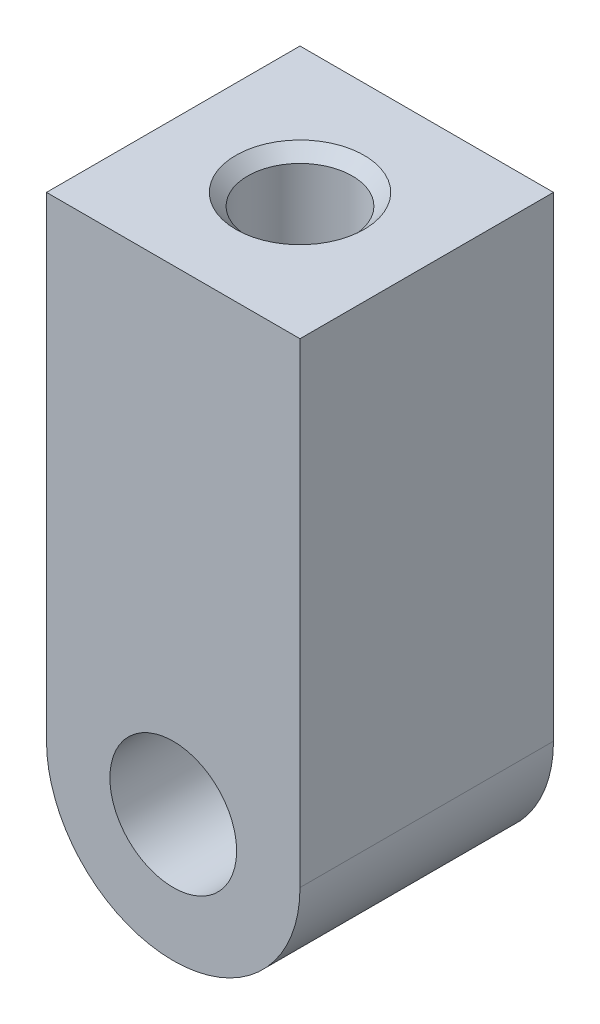
ISO-10303-21;
HEADER;
FILE_DESCRIPTION(('STEP AP214'),'2;1');
FILE_NAME('part.step','',(''),(''),'','','');
FILE_SCHEMA(('AUTOMOTIVE_DESIGN { 1 0 10303 214 1 1 1 1 }'));
ENDSEC;
DATA;
#1=APPLICATION_CONTEXT('core data for automotive mechanical design processes');
#2=APPLICATION_PROTOCOL_DEFINITION('international standard','automotive_design',2000,#1);
#3=PRODUCT_CONTEXT('',#1,'mechanical');
#4=PRODUCT('Part','Part','',(#3));
#5=PRODUCT_RELATED_PRODUCT_CATEGORY('part','',(#4));
#6=PRODUCT_DEFINITION_FORMATION('','',#4);
#7=PRODUCT_DEFINITION_CONTEXT('part definition',#1,'design');
#8=PRODUCT_DEFINITION('design','',#6,#7);
#9=PRODUCT_DEFINITION_SHAPE('','',#8);
#10=(LENGTH_UNIT() NAMED_UNIT(*) SI_UNIT(.MILLI.,.METRE.));
#11=(NAMED_UNIT(*) PLANE_ANGLE_UNIT() SI_UNIT($,.RADIAN.));
#12=(NAMED_UNIT(*) SI_UNIT($,.STERADIAN.) SOLID_ANGLE_UNIT());
#13=UNCERTAINTY_MEASURE_WITH_UNIT(LENGTH_MEASURE(1.E-05),#10,'distance_accuracy_value','');
#14=(GEOMETRIC_REPRESENTATION_CONTEXT(3) GLOBAL_UNCERTAINTY_ASSIGNED_CONTEXT((#13)) GLOBAL_UNIT_ASSIGNED_CONTEXT((#10,
#11,#12)) REPRESENTATION_CONTEXT('',''));
#15=CARTESIAN_POINT('',(0.,0.,0.));
#16=DIRECTION('',(0.,0.,1.));
#17=DIRECTION('',(1.,0.,0.));
#18=AXIS2_PLACEMENT_3D('',#15,#16,#17);
#19=CARTESIAN_POINT('',(0.,0.,8.));
#20=DIRECTION('',(0.,0.,1.));
#21=DIRECTION('',(1.,0.,0.));
#22=AXIS2_PLACEMENT_3D('',#19,#20,#21);
#23=PLANE('',#22);
#24=CARTESIAN_POINT('',(0.,0.,8.));
#25=DIRECTION('',(0.,0.,1.));
#26=DIRECTION('',(1.,0.,0.));
#27=AXIS2_PLACEMENT_3D('',#24,#25,#26);
#28=CIRCLE('',#27,4.);
#29=CARTESIAN_POINT('',(-4.,0.,8.));
#30=VERTEX_POINT('',#29);
#31=CARTESIAN_POINT('',(4.,0.,8.));
#32=VERTEX_POINT('',#31);
#33=EDGE_CURVE('E91',#30,#32,#28,.T.);
#34=ORIENTED_EDGE('',*,*,#33,.T.);
#35=DIRECTION('',(0.,1.,0.));
#36=VECTOR('',#35,1.);
#37=CARTESIAN_POINT('',(4.,0.,8.));
#38=LINE('',#37,#36);
#39=CARTESIAN_POINT('',(4.,15.,8.));
#40=VERTEX_POINT('',#39);
#41=EDGE_CURVE('E86',#32,#40,#38,.T.);
#42=ORIENTED_EDGE('',*,*,#41,.T.);
#43=DIRECTION('',(-1.,0.,0.));
#44=VECTOR('',#43,1.);
#45=CARTESIAN_POINT('',(4.,15.,8.));
#46=LINE('',#45,#44);
#47=CARTESIAN_POINT('',(-4.,15.,8.));
#48=VERTEX_POINT('',#47);
#49=EDGE_CURVE('E89',#40,#48,#46,.T.);
#50=ORIENTED_EDGE('',*,*,#49,.T.);
#51=DIRECTION('',(0.,-1.,0.));
#52=VECTOR('',#51,1.);
#53=CARTESIAN_POINT('',(-4.,15.,8.));
#54=LINE('',#53,#52);
#55=EDGE_CURVE('E56',#48,#30,#54,.T.);
#56=ORIENTED_EDGE('',*,*,#55,.T.);
#57=EDGE_LOOP('',(#34,#42,#50,#56));
#58=FACE_BOUND('',#57,.T.);
#59=CARTESIAN_POINT('',(0.,0.,8.));
#60=DIRECTION('',(0.,0.,1.));
#61=DIRECTION('',(1.,0.,0.));
#62=AXIS2_PLACEMENT_3D('',#59,#60,#61);
#63=CIRCLE('',#62,2.);
#64=CARTESIAN_POINT('',(2.,0.,8.));
#65=VERTEX_POINT('',#64);
#66=EDGE_CURVE('E106',#65,#65,#63,.T.);
#67=ORIENTED_EDGE('',*,*,#66,.F.);
#68=EDGE_LOOP('',(#67));
#69=FACE_BOUND('',#68,.T.);
#70=ADVANCED_FACE('F39',(#58,#69),#23,.T.);
#71=CARTESIAN_POINT('',(0.,0.,0.));
#72=DIRECTION('',(0.,0.,1.));
#73=DIRECTION('',(1.,0.,0.));
#74=AXIS2_PLACEMENT_3D('',#71,#72,#73);
#75=PLANE('',#74);
#76=CARTESIAN_POINT('',(0.,0.,0.));
#77=DIRECTION('',(0.,0.,1.));
#78=DIRECTION('',(1.,0.,0.));
#79=AXIS2_PLACEMENT_3D('',#76,#77,#78);
#80=CIRCLE('',#79,4.);
#81=CARTESIAN_POINT('',(-4.,0.,0.));
#82=VERTEX_POINT('',#81);
#83=CARTESIAN_POINT('',(4.,0.,0.));
#84=VERTEX_POINT('',#83);
#85=EDGE_CURVE('E103',#82,#84,#80,.T.);
#86=ORIENTED_EDGE('',*,*,#85,.F.);
#87=DIRECTION('',(0.,-1.,0.));
#88=VECTOR('',#87,1.);
#89=CARTESIAN_POINT('',(-4.,15.,0.));
#90=LINE('',#89,#88);
#91=CARTESIAN_POINT('',(-4.,15.,0.));
#92=VERTEX_POINT('',#91);
#93=EDGE_CURVE('E79',#92,#82,#90,.T.);
#94=ORIENTED_EDGE('',*,*,#93,.F.);
#95=DIRECTION('',(-1.,0.,0.));
#96=VECTOR('',#95,1.);
#97=CARTESIAN_POINT('',(4.,15.,0.));
#98=LINE('',#97,#96);
#99=CARTESIAN_POINT('',(4.,15.,0.));
#100=VERTEX_POINT('',#99);
#101=EDGE_CURVE('E73',#100,#92,#98,.T.);
#102=ORIENTED_EDGE('',*,*,#101,.F.);
#103=DIRECTION('',(0.,1.,0.));
#104=VECTOR('',#103,1.);
#105=CARTESIAN_POINT('',(4.,0.,0.));
#106=LINE('',#105,#104);
#107=EDGE_CURVE('E95',#84,#100,#106,.T.);
#108=ORIENTED_EDGE('',*,*,#107,.F.);
#109=EDGE_LOOP('',(#86,#94,#102,#108));
#110=FACE_BOUND('',#109,.T.);
#111=CARTESIAN_POINT('',(0.,0.,0.));
#112=DIRECTION('',(0.,0.,1.));
#113=DIRECTION('',(1.,0.,0.));
#114=AXIS2_PLACEMENT_3D('',#111,#112,#113);
#115=CIRCLE('',#114,2.);
#116=CARTESIAN_POINT('',(2.,0.,0.));
#117=VERTEX_POINT('',#116);
#118=EDGE_CURVE('E118',#117,#117,#115,.T.);
#119=ORIENTED_EDGE('',*,*,#118,.T.);
#120=EDGE_LOOP('',(#119));
#121=FACE_BOUND('',#120,.T.);
#122=ADVANCED_FACE('F114',(#110,#121),#75,.F.);
#123=CARTESIAN_POINT('',(0.,0.,8.));
#124=DIRECTION('',(0.,0.,-1.));
#125=DIRECTION('',(-1.,0.,0.));
#126=AXIS2_PLACEMENT_3D('',#123,#124,#125);
#127=CYLINDRICAL_SURFACE('',#126,4.);
#128=ORIENTED_EDGE('',*,*,#85,.T.);
#129=DIRECTION('',(0.,0.,-1.));
#130=VECTOR('',#129,1.);
#131=CARTESIAN_POINT('',(4.,0.,8.));
#132=LINE('',#131,#130);
#133=EDGE_CURVE('E11',#32,#84,#132,.T.);
#134=ORIENTED_EDGE('',*,*,#133,.F.);
#135=ORIENTED_EDGE('',*,*,#33,.F.);
#136=DIRECTION('',(0.,0.,-1.));
#137=VECTOR('',#136,1.);
#138=CARTESIAN_POINT('',(-4.,0.,8.));
#139=LINE('',#138,#137);
#140=EDGE_CURVE('E99',#30,#82,#139,.T.);
#141=ORIENTED_EDGE('',*,*,#140,.T.);
#142=EDGE_LOOP('',(#128,#134,#135,#141));
#143=FACE_BOUND('',#142,.T.);
#144=ADVANCED_FACE('F41',(#143),#127,.T.);
#145=CARTESIAN_POINT('',(4.,0.,8.));
#146=DIRECTION('',(-1.,0.,0.));
#147=DIRECTION('',(0.,-1.,0.));
#148=AXIS2_PLACEMENT_3D('',#145,#146,#147);
#149=PLANE('',#148);
#150=ORIENTED_EDGE('',*,*,#107,.T.);
#151=DIRECTION('',(0.,0.,-1.));
#152=VECTOR('',#151,1.);
#153=CARTESIAN_POINT('',(4.,15.,8.));
#154=LINE('',#153,#152);
#155=EDGE_CURVE('E48',#40,#100,#154,.T.);
#156=ORIENTED_EDGE('',*,*,#155,.F.);
#157=ORIENTED_EDGE('',*,*,#41,.F.);
#158=ORIENTED_EDGE('',*,*,#133,.T.);
#159=EDGE_LOOP('',(#150,#156,#157,#158));
#160=FACE_BOUND('',#159,.T.);
#161=ADVANCED_FACE('F94',(#160),#149,.F.);
#162=CARTESIAN_POINT('',(4.,15.,8.));
#163=DIRECTION('',(0.,-1.,0.));
#164=DIRECTION('',(1.,0.,0.));
#165=AXIS2_PLACEMENT_3D('',#162,#163,#164);
#166=PLANE('',#165);
#167=CARTESIAN_POINT('',(0.,15.,4.));
#168=DIRECTION('',(0.,1.,0.));
#169=DIRECTION('',(0.,0.,1.));
#170=AXIS2_PLACEMENT_3D('',#167,#168,#169);
#171=CIRCLE('',#170,2.025);
#172=CARTESIAN_POINT('',(0.,15.,6.025));
#173=VERTEX_POINT('',#172);
#174=EDGE_CURVE('E231',#173,#173,#171,.T.);
#175=ORIENTED_EDGE('',*,*,#174,.F.);
#176=EDGE_LOOP('',(#175));
#177=FACE_BOUND('',#176,.T.);
#178=ORIENTED_EDGE('',*,*,#101,.T.);
#179=DIRECTION('',(0.,0.,-1.));
#180=VECTOR('',#179,1.);
#181=CARTESIAN_POINT('',(-4.,15.,8.));
#182=LINE('',#181,#180);
#183=EDGE_CURVE('E96',#48,#92,#182,.T.);
#184=ORIENTED_EDGE('',*,*,#183,.F.);
#185=ORIENTED_EDGE('',*,*,#49,.F.);
#186=ORIENTED_EDGE('',*,*,#155,.T.);
#187=EDGE_LOOP('',(#178,#184,#185,#186));
#188=FACE_BOUND('',#187,.T.);
#189=ADVANCED_FACE('F97',(#177,#188),#166,.F.);
#190=CARTESIAN_POINT('',(-4.,15.,8.));
#191=DIRECTION('',(1.,0.,0.));
#192=DIRECTION('',(0.,1.,0.));
#193=AXIS2_PLACEMENT_3D('',#190,#191,#192);
#194=PLANE('',#193);
#195=ORIENTED_EDGE('',*,*,#93,.T.);
#196=ORIENTED_EDGE('',*,*,#140,.F.);
#197=ORIENTED_EDGE('',*,*,#55,.F.);
#198=ORIENTED_EDGE('',*,*,#183,.T.);
#199=EDGE_LOOP('',(#195,#196,#197,#198));
#200=FACE_BOUND('',#199,.T.);
#201=ADVANCED_FACE('F111',(#200),#194,.F.);
#202=CARTESIAN_POINT('',(0.,0.,8.));
#203=DIRECTION('',(0.,0.,-1.));
#204=DIRECTION('',(-1.,0.,0.));
#205=AXIS2_PLACEMENT_3D('',#202,#203,#204);
#206=CYLINDRICAL_SURFACE('',#205,2.);
#207=CARTESIAN_POINT('',(0.,2.,5.65));
#208=CARTESIAN_POINT('',(-0.0785582667604114,1.99999366658903,5.64999350864754));
#209=CARTESIAN_POINT('',(-0.157187203120869,1.99532684549041,5.64434512093698));
#210=CARTESIAN_POINT('',(-0.311864639119565,1.97707676446012,5.62215000896264));
#211=CARTESIAN_POINT('',(-0.387909229411207,1.96348057790889,5.60558748470299));
#212=CARTESIAN_POINT('',(-0.534791047337124,1.92864279933125,5.56279134157272));
#213=CARTESIAN_POINT('',(-0.605657458967865,1.90744880464853,5.53661790708388));
#214=CARTESIAN_POINT('',(-0.741387966566496,1.85891132508154,5.47593393904634));
#215=CARTESIAN_POINT('',(-0.806250869204592,1.83156662129763,5.44142175288806));
#216=CARTESIAN_POINT('',(-0.951700806708838,1.76151205715045,5.35147931277491));
#217=CARTESIAN_POINT('',(-1.02945448662967,1.71682701371144,5.29300268475238));
#218=CARTESIAN_POINT('',(-1.172252458918,1.62270689094313,5.16514433141969));
#219=CARTESIAN_POINT('',(-1.23725977062541,1.57325859344596,5.09573189920763));
#220=CARTESIAN_POINT('',(-1.3554292865677,1.47271642854877,4.94582794490879));
#221=CARTESIAN_POINT('',(-1.40835986186317,1.42160893874489,4.86516109270983));
#222=CARTESIAN_POINT('',(-1.4772320555906,1.3486716085019,4.73663576212628));
#223=CARTESIAN_POINT('',(-1.49842304085224,1.3249968757223,4.69257719190757));
#224=CARTESIAN_POINT('',(-1.53713061973868,1.27988584459917,4.60180064065173));
#225=CARTESIAN_POINT('',(-1.55465036884759,1.25844763195792,4.5550849877));
#226=CARTESIAN_POINT('',(-1.5873810081882,1.21696065736944,4.45371028176249));
#227=CARTESIAN_POINT('',(-1.60214217801139,1.19730807425635,4.39873684547993));
#228=CARTESIAN_POINT('',(-1.62608774735319,1.16458343953829,4.28575684255247));
#229=CARTESIAN_POINT('',(-1.63528596332251,1.15149509856243,4.2277581823516));
#230=CARTESIAN_POINT('',(-1.64748010660325,1.13399110780644,4.10906084287105));
#231=CARTESIAN_POINT('',(-1.65040522091686,1.12967450475142,4.04833915647673));
#232=CARTESIAN_POINT('',(-1.64950300780659,1.13099037118302,3.92705019651996));
#233=CARTESIAN_POINT('',(-1.64567372646979,1.13662571957271,3.86648297271646));
#234=CARTESIAN_POINT('',(-1.63095758572914,1.15764682115701,3.74143465931325));
#235=CARTESIAN_POINT('',(-1.6193750060645,1.17398997972638,3.67720600800186));
#236=CARTESIAN_POINT('',(-1.5895119825712,1.21411476501242,3.55270021447618));
#237=CARTESIAN_POINT('',(-1.57120996015326,1.23792031980404,3.49243654880364));
#238=CARTESIAN_POINT('',(-1.51673157420857,1.30470759276435,3.34314863015232));
#239=CARTESIAN_POINT('',(-1.47630129475714,1.35091731808568,3.25714891388779));
#240=CARTESIAN_POINT('',(-1.38258304938965,1.44672105311959,3.09458523599828));
#241=CARTESIAN_POINT('',(-1.32927309269434,1.49632074586897,3.01803775459526));
#242=CARTESIAN_POINT('',(-1.20742126893984,1.59644406608846,2.87122819987709));
#243=CARTESIAN_POINT('',(-1.13830669528422,1.64691043775786,2.80139797719683));
#244=CARTESIAN_POINT('',(-0.986507205783498,1.74206669267044,2.67369290111196));
#245=CARTESIAN_POINT('',(-0.903854683330531,1.78676992035198,2.61579023664966));
#246=CARTESIAN_POINT('',(-0.748960567320869,1.85587241631985,2.52782825119727));
#247=CARTESIAN_POINT('',(-0.679617312262913,1.88252715062756,2.49444514000174));
#248=CARTESIAN_POINT('',(-0.534849197146017,1.9286499795853,2.43715607309736));
#249=CARTESIAN_POINT('',(-0.459428514235436,1.94812295993112,2.41324367370976));
#250=CARTESIAN_POINT('',(-0.303683988387772,1.97840979856869,2.37620193277232));
#251=CARTESIAN_POINT('',(-0.223329901142371,1.98916297422121,2.36314814223672));
#252=CARTESIAN_POINT('',(-0.0608700369972302,2.00072805299078,2.34911245091645));
#253=CARTESIAN_POINT('',(0.0212348254674247,2.00154502429824,2.34812439572386));
#254=CARTESIAN_POINT('',(0.175231511566745,1.99363663469043,2.35771758077336));
#255=CARTESIAN_POINT('',(0.247260905612036,1.98594188004175,2.3670492662321));
#256=CARTESIAN_POINT('',(0.388348941813534,1.96323526496901,2.39474133309962));
#257=CARTESIAN_POINT('',(0.457407109012373,1.94822223939712,2.41310315220741));
#258=CARTESIAN_POINT('',(0.592909102348674,1.91142019863943,2.45850430639637));
#259=CARTESIAN_POINT('',(0.659228732394822,1.88945612639071,2.48576847846743));
#260=CARTESIAN_POINT('',(0.786201539461074,1.84025315648388,2.54762886292437));
#261=CARTESIAN_POINT('',(0.846852879943424,1.81301255794355,2.58222743988768));
#262=CARTESIAN_POINT('',(0.988087601426688,1.74139910544497,2.67478770828534));
#263=CARTESIAN_POINT('',(1.06528377474377,1.69484894756066,2.73623972493014));
#264=CARTESIAN_POINT('',(1.20654510054967,1.59738336789277,2.87027037940537));
#265=CARTESIAN_POINT('',(1.27056180867692,1.54645278374857,2.9428884110757));
#266=CARTESIAN_POINT('',(1.35692085001383,1.46979229153475,3.05996542061008));
#267=CARTESIAN_POINT('',(1.38429278359127,1.44396643463515,3.10074508014025));
#268=CARTESIAN_POINT('',(1.43549850350013,1.39307024067463,3.18496874193481));
#269=CARTESIAN_POINT('',(1.45933075893483,1.36800023423032,3.22841388559831));
#270=CARTESIAN_POINT('',(1.50321926158975,1.31961904537951,3.31786763716402));
#271=CARTESIAN_POINT('',(1.52328929292478,1.29630163773667,3.3638660538701));
#272=CARTESIAN_POINT('',(1.559488926634,1.25251739389329,3.45864574899219));
#273=CARTESIAN_POINT('',(1.57562305153888,1.23204729774673,3.50742375324274));
#274=CARTESIAN_POINT('',(1.60428386463759,1.19451272670361,3.61042045601127));
#275=CARTESIAN_POINT('',(1.61658252246908,1.17767736350222,3.66478993525333));
#276=CARTESIAN_POINT('',(1.63570451487264,1.15097653734916,3.77607761604721));
#277=CARTESIAN_POINT('',(1.64254219800339,1.14109281736799,3.83298872082346));
#278=CARTESIAN_POINT('',(1.65022105706451,1.12996646731564,3.94858460657332));
#279=CARTESIAN_POINT('',(1.65101246906034,1.1287955501554,4.00728012323165));
#280=CARTESIAN_POINT('',(1.64637831960868,1.1355396669476,4.12392204606258));
#281=CARTESIAN_POINT('',(1.64094543910419,1.14346539753846,4.18186748913636));
#282=CARTESIAN_POINT('',(1.62265234485891,1.16931096341343,4.30708500788615));
#283=CARTESIAN_POINT('',(1.60848260874829,1.18896626566532,4.37379097157262));
#284=CARTESIAN_POINT('',(1.5730019138095,1.23552465431787,4.50265433784971));
#285=CARTESIAN_POINT('',(1.5516681895302,1.26245079158793,4.56479646059134));
#286=CARTESIAN_POINT('',(1.48909245140218,1.33643317144427,4.71781160217394));
#287=CARTESIAN_POINT('',(1.4433762716877,1.38635837480664,4.80545052723172));
#288=CARTESIAN_POINT('',(1.3379902813443,1.48835904565364,4.97049994478027));
#289=CARTESIAN_POINT('',(1.27829918544903,1.54043769242291,5.04789454976649));
#290=CARTESIAN_POINT('',(1.14311282455067,1.6433918845405,5.19415187604185));
#291=CARTESIAN_POINT('',(1.06719721900784,1.69418448820892,5.26268905309512));
#292=CARTESIAN_POINT('',(0.900980733183307,1.78809577182673,5.3861363278963));
#293=CARTESIAN_POINT('',(0.810720969212254,1.83123566144912,5.44108426081618));
#294=CARTESIAN_POINT('',(0.647298740673356,1.89370637278163,5.51953660480873));
#295=CARTESIAN_POINT('',(0.577506765834126,1.91627251214554,5.54750823449909));
#296=CARTESIAN_POINT('',(0.432987088850894,1.95398617554296,5.59397267339676));
#297=CARTESIAN_POINT('',(0.358270075019159,1.96914920086438,5.61248529252502));
#298=CARTESIAN_POINT('',(0.235817550522066,1.98660111146835,5.6337389601132));
#299=CARTESIAN_POINT('',(0.189016871635864,1.99160757732751,5.63981892624818));
#300=CARTESIAN_POINT('',(0.0948194728301796,1.9983093303494,5.64795188846987));
#301=CARTESIAN_POINT('',(0.0474226126771205,2.0000038232373,5.65000391858052));
#302=CARTESIAN_POINT('',(0.,2.,5.65));
#303=B_SPLINE_CURVE_WITH_KNOTS('',3,(#207,#208,#209,#210,#211,#212,#213,#214,#215,#216,#217,
#218,#219,#220,#221,#222,#223,#224,#225,#226,#227,#228,#229,#230,#231,#232,#233,#234,#235,#236,
#237,#238,#239,#240,#241,#242,#243,#244,#245,#246,#247,#248,#249,#250,#251,#252,#253,#254,#255,
#256,#257,#258,#259,#260,#261,#262,#263,#264,#265,#266,#267,#268,#269,#270,#271,#272,#273,#274,
#275,#276,#277,#278,#279,#280,#281,#282,#283,#284,#285,#286,#287,#288,#289,#290,#291,#292,#293,
#294,#295,#296,#297,#298,#299,#300,#301,#302),.UNSPECIFIED.,.T.,.F.,(4,2,2,2,2,2,2,2,2,2,2,2,2,
2,2,2,2,2,2,2,2,2,2,2,2,2,2,2,2,2,2,2,2,2,2,2,2,2,2,2,2,2,2,2,2,2,2,4),(0.,0.235471222690579,
0.471284079539235,0.705644759879192,0.940051924976307,1.25950624124602,1.57987409529034,
1.90594877564507,2.06873175492618,2.23137424056988,2.41147549746346,2.59112758834872,
2.77279720816551,2.9545193900256,3.15523212253696,3.35659513698606,3.67191533847616,
3.98777777090454,4.31770974714402,4.64686350073553,4.89025693036313,5.13348447441819,
5.37839049526441,5.62317159089863,5.84126635855839,6.05939586060904,6.28352652495014,
6.50772955815002,6.83330562455545,7.16005786129864,7.32638545695747,7.49278478046596,
7.65856199249995,7.8241478123496,7.9982441900031,8.1718816153763,8.34694664264312,
8.5222177378554,8.73393454363304,8.94633060398358,9.27680890214022,9.60779386628659,
9.94870668565149,10.2886593707634,10.5232556895364,10.7573586605447,10.8994695298514,
11.0416144758992),.UNSPECIFIED.);
#304=CARTESIAN_POINT('',(0.,2.,5.65));
#305=VERTEX_POINT('',#304);
#306=EDGE_CURVE('E121',#305,#305,#303,.T.);
#307=ORIENTED_EDGE('',*,*,#306,.F.);
#308=EDGE_LOOP('',(#307));
#309=FACE_BOUND('',#308,.T.);
#310=ORIENTED_EDGE('',*,*,#66,.T.);
#311=EDGE_LOOP('',(#310));
#312=FACE_BOUND('',#311,.T.);
#313=ORIENTED_EDGE('',*,*,#118,.F.);
#314=EDGE_LOOP('',(#313));
#315=FACE_BOUND('',#314,.T.);
#316=ADVANCED_FACE('F140',(#309,#312,#315),#206,.F.);
#317=CARTESIAN_POINT('',(0.,15.,4.));
#318=DIRECTION('',(0.,1.,0.));
#319=DIRECTION('',(0.,0.,1.));
#320=AXIS2_PLACEMENT_3D('',#317,#318,#319);
#321=CYLINDRICAL_SURFACE('',#320,1.65);
#322=CARTESIAN_POINT('',(0.,14.625,4.));
#323=DIRECTION('',(0.,1.,0.));
#324=DIRECTION('',(0.,0.,1.));
#325=AXIS2_PLACEMENT_3D('',#322,#323,#324);
#326=CIRCLE('',#325,1.65);
#327=CARTESIAN_POINT('',(0.,14.625,5.65));
#328=VERTEX_POINT('',#327);
#329=EDGE_CURVE('E131',#328,#328,#326,.T.);
#330=ORIENTED_EDGE('',*,*,#329,.T.);
#331=EDGE_LOOP('',(#330));
#332=FACE_BOUND('',#331,.T.);
#333=ORIENTED_EDGE('',*,*,#306,.T.);
#334=EDGE_LOOP('',(#333));
#335=FACE_BOUND('',#334,.T.);
#336=ADVANCED_FACE('F135',(#332,#335),#321,.F.);
#337=CARTESIAN_POINT('',(0.,15.,4.));
#338=DIRECTION('',(0.,1.,0.));
#339=DIRECTION('',(0.,0.,1.));
#340=AXIS2_PLACEMENT_3D('',#337,#338,#339);
#341=CONICAL_SURFACE('',#340,2.025,0.785398163397451);
#342=ORIENTED_EDGE('',*,*,#329,.F.);
#343=EDGE_LOOP('',(#342));
#344=FACE_BOUND('',#343,.T.);
#345=ORIENTED_EDGE('',*,*,#174,.T.);
#346=EDGE_LOOP('',(#345));
#347=FACE_BOUND('',#346,.T.);
#348=ADVANCED_FACE('F139',(#344,#347),#341,.F.);
#349=CLOSED_SHELL('',(#70,#122,#144,#161,#189,#201,#316,#336,#348));
#350=MANIFOLD_SOLID_BREP('B2',#349);
#351=ADVANCED_BREP_SHAPE_REPRESENTATION('',(#18,#350),#14);
#352=SHAPE_DEFINITION_REPRESENTATION(#9,#351);
ENDSEC;
END-ISO-10303-21;
